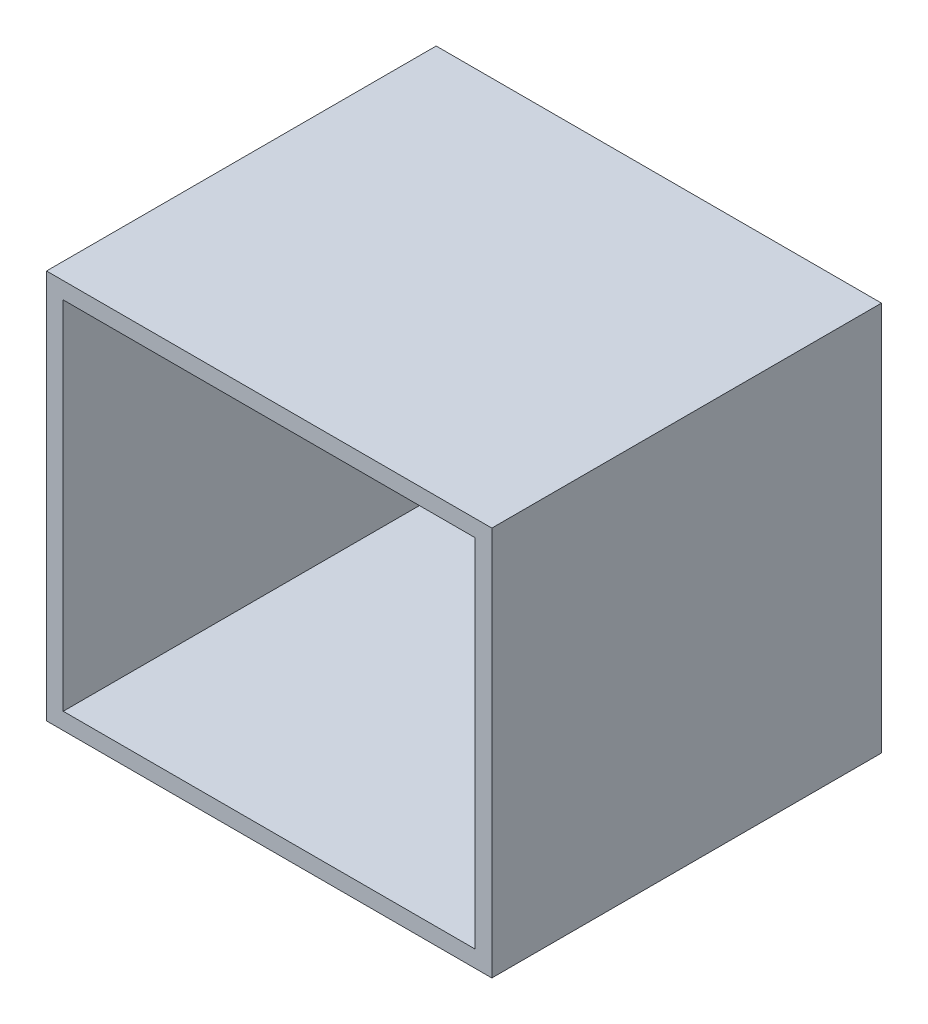
ISO-10303-21;
HEADER;
FILE_DESCRIPTION(('STEP AP214'),'2;1');
FILE_NAME('part.step','',(''),(''),'','','');
FILE_SCHEMA(('AUTOMOTIVE_DESIGN { 1 0 10303 214 1 1 1 1 }'));
ENDSEC;
DATA;
#1=APPLICATION_CONTEXT('core data for automotive mechanical design processes');
#2=APPLICATION_PROTOCOL_DEFINITION('international standard','automotive_design',2000,#1);
#3=PRODUCT_CONTEXT('',#1,'mechanical');
#4=PRODUCT('Part','Part','',(#3));
#5=PRODUCT_RELATED_PRODUCT_CATEGORY('part','',(#4));
#6=PRODUCT_DEFINITION_FORMATION('','',#4);
#7=PRODUCT_DEFINITION_CONTEXT('part definition',#1,'design');
#8=PRODUCT_DEFINITION('design','',#6,#7);
#9=PRODUCT_DEFINITION_SHAPE('','',#8);
#10=(LENGTH_UNIT() NAMED_UNIT(*) SI_UNIT(.MILLI.,.METRE.));
#11=(NAMED_UNIT(*) PLANE_ANGLE_UNIT() SI_UNIT($,.RADIAN.));
#12=(NAMED_UNIT(*) SI_UNIT($,.STERADIAN.) SOLID_ANGLE_UNIT());
#13=UNCERTAINTY_MEASURE_WITH_UNIT(LENGTH_MEASURE(1.E-05),#10,'distance_accuracy_value','');
#14=(GEOMETRIC_REPRESENTATION_CONTEXT(3) GLOBAL_UNCERTAINTY_ASSIGNED_CONTEXT((#13)) GLOBAL_UNIT_ASSIGNED_CONTEXT((#10,
#11,#12)) REPRESENTATION_CONTEXT('',''));
#15=CARTESIAN_POINT('',(0.,0.,0.));
#16=DIRECTION('',(0.,0.,1.));
#17=DIRECTION('',(1.,0.,0.));
#18=AXIS2_PLACEMENT_3D('',#15,#16,#17);
#19=CARTESIAN_POINT('',(0.,0.,350.));
#20=DIRECTION('',(0.,0.,-1.));
#21=DIRECTION('',(-1.,0.,0.));
#22=AXIS2_PLACEMENT_3D('',#19,#20,#21);
#23=PLANE('',#22);
#24=DIRECTION('',(0.,1.,0.));
#25=VECTOR('',#24,1.);
#26=CARTESIAN_POINT('',(400.,-175.,350.));
#27=LINE('',#26,#25);
#28=CARTESIAN_POINT('',(400.,-175.,350.));
#29=VERTEX_POINT('',#28);
#30=CARTESIAN_POINT('',(400.,175.,350.));
#31=VERTEX_POINT('',#30);
#32=EDGE_CURVE('E134',#29,#31,#27,.T.);
#33=ORIENTED_EDGE('',*,*,#32,.T.);
#34=DIRECTION('',(-1.,0.,0.));
#35=VECTOR('',#34,1.);
#36=CARTESIAN_POINT('',(0.,175.,350.));
#37=LINE('',#36,#35);
#38=CARTESIAN_POINT('',(0.,175.,350.));
#39=VERTEX_POINT('',#38);
#40=EDGE_CURVE('E137',#31,#39,#37,.T.);
#41=ORIENTED_EDGE('',*,*,#40,.T.);
#42=DIRECTION('',(0.,-1.,0.));
#43=VECTOR('',#42,1.);
#44=CARTESIAN_POINT('',(0.,-175.,350.));
#45=LINE('',#44,#43);
#46=CARTESIAN_POINT('',(0.,-175.,350.));
#47=VERTEX_POINT('',#46);
#48=EDGE_CURVE('E140',#39,#47,#45,.T.);
#49=ORIENTED_EDGE('',*,*,#48,.T.);
#50=DIRECTION('',(1.,0.,0.));
#51=VECTOR('',#50,1.);
#52=CARTESIAN_POINT('',(0.,-175.,350.));
#53=LINE('',#52,#51);
#54=EDGE_CURVE('E142',#47,#29,#53,.T.);
#55=ORIENTED_EDGE('',*,*,#54,.T.);
#56=EDGE_LOOP('',(#33,#41,#49,#55));
#57=FACE_BOUND('',#56,.T.);
#58=DIRECTION('',(0.,-1.,0.));
#59=VECTOR('',#58,1.);
#60=CARTESIAN_POINT('',(15.,160.,350.));
#61=LINE('',#60,#59);
#62=CARTESIAN_POINT('',(15.,160.,350.));
#63=VERTEX_POINT('',#62);
#64=CARTESIAN_POINT('',(15.,-160.,350.));
#65=VERTEX_POINT('',#64);
#66=EDGE_CURVE('E98',#63,#65,#61,.T.);
#67=ORIENTED_EDGE('',*,*,#66,.F.);
#68=DIRECTION('',(-1.,0.,0.));
#69=VECTOR('',#68,1.);
#70=CARTESIAN_POINT('',(15.,160.,350.));
#71=LINE('',#70,#69);
#72=CARTESIAN_POINT('',(385.,160.,350.));
#73=VERTEX_POINT('',#72);
#74=EDGE_CURVE('E120',#73,#63,#71,.T.);
#75=ORIENTED_EDGE('',*,*,#74,.F.);
#76=DIRECTION('',(0.,1.,0.));
#77=VECTOR('',#76,1.);
#78=CARTESIAN_POINT('',(385.,160.,350.));
#79=LINE('',#78,#77);
#80=CARTESIAN_POINT('',(385.,-160.,350.));
#81=VERTEX_POINT('',#80);
#82=EDGE_CURVE('E118',#81,#73,#79,.T.);
#83=ORIENTED_EDGE('',*,*,#82,.F.);
#84=DIRECTION('',(1.,0.,0.));
#85=VECTOR('',#84,1.);
#86=CARTESIAN_POINT('',(15.,-160.,350.));
#87=LINE('',#86,#85);
#88=EDGE_CURVE('E106',#65,#81,#87,.T.);
#89=ORIENTED_EDGE('',*,*,#88,.F.);
#90=EDGE_LOOP('',(#67,#75,#83,#89));
#91=FACE_BOUND('',#90,.T.);
#92=ADVANCED_FACE('F33',(#57,#91),#23,.F.);
#93=CARTESIAN_POINT('',(0.,0.,0.));
#94=DIRECTION('',(0.,0.,-1.));
#95=DIRECTION('',(-1.,0.,0.));
#96=AXIS2_PLACEMENT_3D('',#93,#94,#95);
#97=PLANE('',#96);
#98=DIRECTION('',(0.,1.,0.));
#99=VECTOR('',#98,1.);
#100=CARTESIAN_POINT('',(400.,-175.,0.));
#101=LINE('',#100,#99);
#102=CARTESIAN_POINT('',(400.,-175.,0.));
#103=VERTEX_POINT('',#102);
#104=CARTESIAN_POINT('',(400.,175.,0.));
#105=VERTEX_POINT('',#104);
#106=EDGE_CURVE('E114',#103,#105,#101,.T.);
#107=ORIENTED_EDGE('',*,*,#106,.F.);
#108=DIRECTION('',(1.,0.,0.));
#109=VECTOR('',#108,1.);
#110=CARTESIAN_POINT('',(0.,-175.,0.));
#111=LINE('',#110,#109);
#112=CARTESIAN_POINT('',(0.,-175.,0.));
#113=VERTEX_POINT('',#112);
#114=EDGE_CURVE('E138',#113,#103,#111,.T.);
#115=ORIENTED_EDGE('',*,*,#114,.F.);
#116=DIRECTION('',(0.,-1.,0.));
#117=VECTOR('',#116,1.);
#118=CARTESIAN_POINT('',(0.,-175.,0.));
#119=LINE('',#118,#117);
#120=CARTESIAN_POINT('',(0.,175.,0.));
#121=VERTEX_POINT('',#120);
#122=EDGE_CURVE('E149',#121,#113,#119,.T.);
#123=ORIENTED_EDGE('',*,*,#122,.F.);
#124=DIRECTION('',(-1.,0.,0.));
#125=VECTOR('',#124,1.);
#126=CARTESIAN_POINT('',(0.,175.,0.));
#127=LINE('',#126,#125);
#128=EDGE_CURVE('E147',#105,#121,#127,.T.);
#129=ORIENTED_EDGE('',*,*,#128,.F.);
#130=EDGE_LOOP('',(#107,#115,#123,#129));
#131=FACE_BOUND('',#130,.T.);
#132=DIRECTION('',(-1.,0.,0.));
#133=VECTOR('',#132,1.);
#134=CARTESIAN_POINT('',(15.,160.,0.));
#135=LINE('',#134,#133);
#136=CARTESIAN_POINT('',(385.,160.,0.));
#137=VERTEX_POINT('',#136);
#138=CARTESIAN_POINT('',(15.,160.,0.));
#139=VERTEX_POINT('',#138);
#140=EDGE_CURVE('E107',#137,#139,#135,.T.);
#141=ORIENTED_EDGE('',*,*,#140,.T.);
#142=DIRECTION('',(0.,-1.,0.));
#143=VECTOR('',#142,1.);
#144=CARTESIAN_POINT('',(15.,160.,0.));
#145=LINE('',#144,#143);
#146=CARTESIAN_POINT('',(15.,-160.,0.));
#147=VERTEX_POINT('',#146);
#148=EDGE_CURVE('E56',#139,#147,#145,.T.);
#149=ORIENTED_EDGE('',*,*,#148,.T.);
#150=DIRECTION('',(1.,0.,0.));
#151=VECTOR('',#150,1.);
#152=CARTESIAN_POINT('',(15.,-160.,0.));
#153=LINE('',#152,#151);
#154=CARTESIAN_POINT('',(385.,-160.,0.));
#155=VERTEX_POINT('',#154);
#156=EDGE_CURVE('E113',#147,#155,#153,.T.);
#157=ORIENTED_EDGE('',*,*,#156,.T.);
#158=DIRECTION('',(0.,1.,0.));
#159=VECTOR('',#158,1.);
#160=CARTESIAN_POINT('',(385.,160.,0.));
#161=LINE('',#160,#159);
#162=EDGE_CURVE('E126',#155,#137,#161,.T.);
#163=ORIENTED_EDGE('',*,*,#162,.T.);
#164=EDGE_LOOP('',(#141,#149,#157,#163));
#165=FACE_BOUND('',#164,.T.);
#166=ADVANCED_FACE('F167',(#131,#165),#97,.T.);
#167=CARTESIAN_POINT('',(400.,-175.,350.));
#168=DIRECTION('',(-1.,0.,0.));
#169=DIRECTION('',(0.,-1.,0.));
#170=AXIS2_PLACEMENT_3D('',#167,#168,#169);
#171=PLANE('',#170);
#172=ORIENTED_EDGE('',*,*,#106,.T.);
#173=DIRECTION('',(0.,0.,-1.));
#174=VECTOR('',#173,1.);
#175=CARTESIAN_POINT('',(400.,175.,350.));
#176=LINE('',#175,#174);
#177=EDGE_CURVE('E11',#31,#105,#176,.T.);
#178=ORIENTED_EDGE('',*,*,#177,.F.);
#179=ORIENTED_EDGE('',*,*,#32,.F.);
#180=DIRECTION('',(0.,0.,-1.));
#181=VECTOR('',#180,1.);
#182=CARTESIAN_POINT('',(400.,-175.,350.));
#183=LINE('',#182,#181);
#184=EDGE_CURVE('E144',#29,#103,#183,.T.);
#185=ORIENTED_EDGE('',*,*,#184,.T.);
#186=EDGE_LOOP('',(#172,#178,#179,#185));
#187=FACE_BOUND('',#186,.T.);
#188=ADVANCED_FACE('F35',(#187),#171,.F.);
#189=CARTESIAN_POINT('',(0.,175.,350.));
#190=DIRECTION('',(0.,-1.,0.));
#191=DIRECTION('',(1.,0.,0.));
#192=AXIS2_PLACEMENT_3D('',#189,#190,#191);
#193=PLANE('',#192);
#194=ORIENTED_EDGE('',*,*,#128,.T.);
#195=DIRECTION('',(0.,0.,-1.));
#196=VECTOR('',#195,1.);
#197=CARTESIAN_POINT('',(0.,175.,350.));
#198=LINE('',#197,#196);
#199=EDGE_CURVE('E41',#39,#121,#198,.T.);
#200=ORIENTED_EDGE('',*,*,#199,.F.);
#201=ORIENTED_EDGE('',*,*,#40,.F.);
#202=ORIENTED_EDGE('',*,*,#177,.T.);
#203=EDGE_LOOP('',(#194,#200,#201,#202));
#204=FACE_BOUND('',#203,.T.);
#205=ADVANCED_FACE('F177',(#204),#193,.F.);
#206=CARTESIAN_POINT('',(0.,-175.,350.));
#207=DIRECTION('',(1.,0.,0.));
#208=DIRECTION('',(0.,1.,0.));
#209=AXIS2_PLACEMENT_3D('',#206,#207,#208);
#210=PLANE('',#209);
#211=ORIENTED_EDGE('',*,*,#122,.T.);
#212=DIRECTION('',(0.,0.,-1.));
#213=VECTOR('',#212,1.);
#214=CARTESIAN_POINT('',(0.,-175.,350.));
#215=LINE('',#214,#213);
#216=EDGE_CURVE('E154',#47,#113,#215,.T.);
#217=ORIENTED_EDGE('',*,*,#216,.F.);
#218=ORIENTED_EDGE('',*,*,#48,.F.);
#219=ORIENTED_EDGE('',*,*,#199,.T.);
#220=EDGE_LOOP('',(#211,#217,#218,#219));
#221=FACE_BOUND('',#220,.T.);
#222=ADVANCED_FACE('F161',(#221),#210,.F.);
#223=CARTESIAN_POINT('',(0.,-175.,350.));
#224=DIRECTION('',(0.,1.,0.));
#225=DIRECTION('',(-1.,0.,0.));
#226=AXIS2_PLACEMENT_3D('',#223,#224,#225);
#227=PLANE('',#226);
#228=ORIENTED_EDGE('',*,*,#114,.T.);
#229=ORIENTED_EDGE('',*,*,#184,.F.);
#230=ORIENTED_EDGE('',*,*,#54,.F.);
#231=ORIENTED_EDGE('',*,*,#216,.T.);
#232=EDGE_LOOP('',(#228,#229,#230,#231));
#233=FACE_BOUND('',#232,.T.);
#234=ADVANCED_FACE('F171',(#233),#227,.F.);
#235=CARTESIAN_POINT('',(15.,160.,350.));
#236=DIRECTION('',(1.,0.,0.));
#237=DIRECTION('',(0.,1.,0.));
#238=AXIS2_PLACEMENT_3D('',#235,#236,#237);
#239=PLANE('',#238);
#240=ORIENTED_EDGE('',*,*,#148,.F.);
#241=DIRECTION('',(0.,0.,-1.));
#242=VECTOR('',#241,1.);
#243=CARTESIAN_POINT('',(15.,160.,350.));
#244=LINE('',#243,#242);
#245=EDGE_CURVE('E102',#63,#139,#244,.T.);
#246=ORIENTED_EDGE('',*,*,#245,.F.);
#247=ORIENTED_EDGE('',*,*,#66,.T.);
#248=DIRECTION('',(0.,0.,-1.));
#249=VECTOR('',#248,1.);
#250=CARTESIAN_POINT('',(15.,-160.,350.));
#251=LINE('',#250,#249);
#252=EDGE_CURVE('E101',#65,#147,#251,.T.);
#253=ORIENTED_EDGE('',*,*,#252,.T.);
#254=EDGE_LOOP('',(#240,#246,#247,#253));
#255=FACE_BOUND('',#254,.T.);
#256=ADVANCED_FACE('F100',(#255),#239,.T.);
#257=CARTESIAN_POINT('',(15.,-160.,350.));
#258=DIRECTION('',(0.,1.,0.));
#259=DIRECTION('',(0.,0.,1.));
#260=AXIS2_PLACEMENT_3D('',#257,#258,#259);
#261=PLANE('',#260);
#262=ORIENTED_EDGE('',*,*,#156,.F.);
#263=ORIENTED_EDGE('',*,*,#252,.F.);
#264=ORIENTED_EDGE('',*,*,#88,.T.);
#265=DIRECTION('',(0.,0.,-1.));
#266=VECTOR('',#265,1.);
#267=CARTESIAN_POINT('',(385.,-160.,350.));
#268=LINE('',#267,#266);
#269=EDGE_CURVE('E115',#81,#155,#268,.T.);
#270=ORIENTED_EDGE('',*,*,#269,.T.);
#271=EDGE_LOOP('',(#262,#263,#264,#270));
#272=FACE_BOUND('',#271,.T.);
#273=ADVANCED_FACE('F110',(#272),#261,.T.);
#274=CARTESIAN_POINT('',(385.,160.,350.));
#275=DIRECTION('',(-1.,0.,0.));
#276=DIRECTION('',(0.,-1.,0.));
#277=AXIS2_PLACEMENT_3D('',#274,#275,#276);
#278=PLANE('',#277);
#279=ORIENTED_EDGE('',*,*,#162,.F.);
#280=ORIENTED_EDGE('',*,*,#269,.F.);
#281=ORIENTED_EDGE('',*,*,#82,.T.);
#282=DIRECTION('',(0.,0.,-1.));
#283=VECTOR('',#282,1.);
#284=CARTESIAN_POINT('',(385.,160.,350.));
#285=LINE('',#284,#283);
#286=EDGE_CURVE('E48',#73,#137,#285,.T.);
#287=ORIENTED_EDGE('',*,*,#286,.T.);
#288=EDGE_LOOP('',(#279,#280,#281,#287));
#289=FACE_BOUND('',#288,.T.);
#290=ADVANCED_FACE('F200',(#289),#278,.T.);
#291=CARTESIAN_POINT('',(15.,160.,350.));
#292=DIRECTION('',(0.,-1.,0.));
#293=DIRECTION('',(0.,0.,-1.));
#294=AXIS2_PLACEMENT_3D('',#291,#292,#293);
#295=PLANE('',#294);
#296=ORIENTED_EDGE('',*,*,#140,.F.);
#297=ORIENTED_EDGE('',*,*,#286,.F.);
#298=ORIENTED_EDGE('',*,*,#74,.T.);
#299=ORIENTED_EDGE('',*,*,#245,.T.);
#300=EDGE_LOOP('',(#296,#297,#298,#299));
#301=FACE_BOUND('',#300,.T.);
#302=ADVANCED_FACE('F204',(#301),#295,.T.);
#303=CLOSED_SHELL('',(#92,#166,#188,#205,#222,#234,#256,#273,#290,#302));
#304=MANIFOLD_SOLID_BREP('B2',#303);
#305=ADVANCED_BREP_SHAPE_REPRESENTATION('',(#18,#304),#14);
#306=SHAPE_DEFINITION_REPRESENTATION(#9,#305);
ENDSEC;
END-ISO-10303-21;
